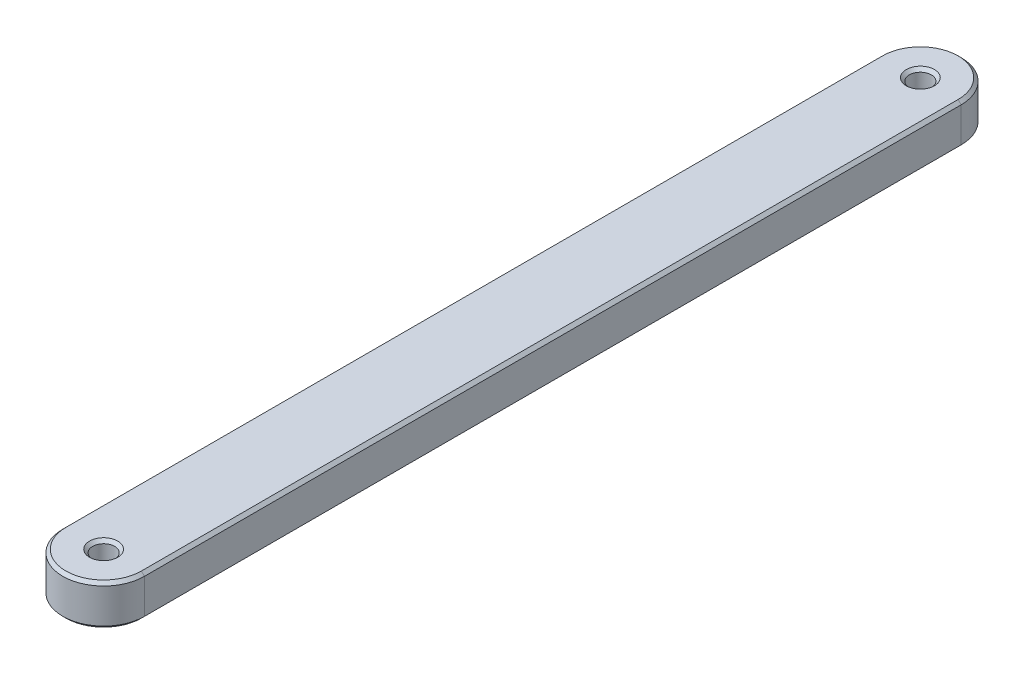
ISO-10303-21;
HEADER;
FILE_DESCRIPTION(('STEP AP214'),'2;1');
FILE_NAME('part.step','',(''),(''),'','','');
FILE_SCHEMA(('AUTOMOTIVE_DESIGN { 1 0 10303 214 1 1 1 1 }'));
ENDSEC;
DATA;
#1=APPLICATION_CONTEXT('core data for automotive mechanical design processes');
#2=APPLICATION_PROTOCOL_DEFINITION('international standard','automotive_design',2000,#1);
#3=PRODUCT_CONTEXT('',#1,'mechanical');
#4=PRODUCT('Part','Part','',(#3));
#5=PRODUCT_RELATED_PRODUCT_CATEGORY('part','',(#4));
#6=PRODUCT_DEFINITION_FORMATION('','',#4);
#7=PRODUCT_DEFINITION_CONTEXT('part definition',#1,'design');
#8=PRODUCT_DEFINITION('design','',#6,#7);
#9=PRODUCT_DEFINITION_SHAPE('','',#8);
#10=(LENGTH_UNIT() NAMED_UNIT(*) SI_UNIT(.MILLI.,.METRE.));
#11=(NAMED_UNIT(*) PLANE_ANGLE_UNIT() SI_UNIT($,.RADIAN.));
#12=(NAMED_UNIT(*) SI_UNIT($,.STERADIAN.) SOLID_ANGLE_UNIT());
#13=UNCERTAINTY_MEASURE_WITH_UNIT(LENGTH_MEASURE(1.E-05),#10,'distance_accuracy_value','');
#14=(GEOMETRIC_REPRESENTATION_CONTEXT(3) GLOBAL_UNCERTAINTY_ASSIGNED_CONTEXT((#13)) GLOBAL_UNIT_ASSIGNED_CONTEXT((#10,
#11,#12)) REPRESENTATION_CONTEXT('',''));
#15=CARTESIAN_POINT('',(0.,0.,0.));
#16=DIRECTION('',(0.,0.,1.));
#17=DIRECTION('',(1.,0.,0.));
#18=AXIS2_PLACEMENT_3D('',#15,#16,#17);
#19=CARTESIAN_POINT('',(0.,10.,100.));
#20=DIRECTION('',(0.,-1.,0.));
#21=DIRECTION('',(0.,0.,-1.));
#22=AXIS2_PLACEMENT_3D('',#19,#20,#21);
#23=CYLINDRICAL_SURFACE('',#22,2.7);
#24=CARTESIAN_POINT('',(0.,4.75000000000005,100.));
#25=DIRECTION('',(0.,-1.,0.));
#26=DIRECTION('',(0.,0.,-1.));
#27=AXIS2_PLACEMENT_3D('',#24,#25,#26);
#28=CIRCLE('',#27,2.7);
#29=CARTESIAN_POINT('',(0.,4.75000000000005,97.3000000000004));
#30=VERTEX_POINT('',#29);
#31=EDGE_CURVE('E197',#30,#30,#28,.T.);
#32=ORIENTED_EDGE('',*,*,#31,.T.);
#33=EDGE_LOOP('',(#32));
#34=FACE_BOUND('',#33,.T.);
#35=CARTESIAN_POINT('',(0.,9.25000000000003,100.));
#36=DIRECTION('',(0.,1.,0.));
#37=DIRECTION('',(0.,0.,1.));
#38=AXIS2_PLACEMENT_3D('',#35,#36,#37);
#39=CIRCLE('',#38,2.7);
#40=CARTESIAN_POINT('',(0.,9.25000000000003,102.7));
#41=VERTEX_POINT('',#40);
#42=EDGE_CURVE('E200',#41,#41,#39,.T.);
#43=ORIENTED_EDGE('',*,*,#42,.T.);
#44=EDGE_LOOP('',(#43));
#45=FACE_BOUND('',#44,.T.);
#46=ADVANCED_FACE('F39',(#34,#45),#23,.F.);
#47=CARTESIAN_POINT('',(0.,10.,-99.9999999999996));
#48=DIRECTION('',(0.,-1.,0.));
#49=DIRECTION('',(0.,0.,-1.));
#50=AXIS2_PLACEMENT_3D('',#47,#48,#49);
#51=CYLINDRICAL_SURFACE('',#50,2.7);
#52=CARTESIAN_POINT('',(0.,4.74999999999996,-99.9999999999996));
#53=DIRECTION('',(0.,-1.,0.));
#54=DIRECTION('',(0.,0.,-1.));
#55=AXIS2_PLACEMENT_3D('',#52,#53,#54);
#56=CIRCLE('',#55,2.7);
#57=CARTESIAN_POINT('',(0.,4.74999999999996,-102.7));
#58=VERTEX_POINT('',#57);
#59=EDGE_CURVE('E131',#58,#58,#56,.T.);
#60=ORIENTED_EDGE('',*,*,#59,.T.);
#61=EDGE_LOOP('',(#60));
#62=FACE_BOUND('',#61,.T.);
#63=CARTESIAN_POINT('',(0.,9.25000000000001,-99.9999999999996));
#64=DIRECTION('',(0.,1.,0.));
#65=DIRECTION('',(0.,0.,1.));
#66=AXIS2_PLACEMENT_3D('',#63,#64,#65);
#67=CIRCLE('',#66,2.7);
#68=CARTESIAN_POINT('',(0.,9.25000000000001,-97.2999999999996));
#69=VERTEX_POINT('',#68);
#70=EDGE_CURVE('E213',#69,#69,#67,.T.);
#71=ORIENTED_EDGE('',*,*,#70,.T.);
#72=EDGE_LOOP('',(#71));
#73=FACE_BOUND('',#72,.T.);
#74=ADVANCED_FACE('F253',(#62,#73),#51,.F.);
#75=CARTESIAN_POINT('',(10.,10.,0.));
#76=DIRECTION('',(-1.,0.,0.));
#77=DIRECTION('',(0.,0.,1.));
#78=AXIS2_PLACEMENT_3D('',#75,#76,#77);
#79=PLANE('',#78);
#80=DIRECTION('',(0.,-1.,0.));
#81=VECTOR('',#80,1.);
#82=CARTESIAN_POINT('',(10.,10.,-99.9999999999996));
#83=LINE('',#82,#81);
#84=CARTESIAN_POINT('',(10.,9.25,-99.9999999999996));
#85=VERTEX_POINT('',#84);
#86=CARTESIAN_POINT('',(10.,0.750000000000028,-99.9999999999996));
#87=VERTEX_POINT('',#86);
#88=EDGE_CURVE('E219',#85,#87,#83,.T.);
#89=ORIENTED_EDGE('',*,*,#88,.F.);
#90=DIRECTION('',(0.,0.,1.));
#91=VECTOR('',#90,1.);
#92=CARTESIAN_POINT('',(10.0000000000001,9.25,100.));
#93=LINE('',#92,#91);
#94=CARTESIAN_POINT('',(10.0000000000001,9.25,100.));
#95=VERTEX_POINT('',#94);
#96=EDGE_CURVE('E177',#85,#95,#93,.T.);
#97=ORIENTED_EDGE('',*,*,#96,.T.);
#98=DIRECTION('',(0.,-1.,0.));
#99=VECTOR('',#98,1.);
#100=CARTESIAN_POINT('',(10.0000000000001,10.,100.));
#101=LINE('',#100,#99);
#102=CARTESIAN_POINT('',(10.0000000000001,0.750000000000028,100.));
#103=VERTEX_POINT('',#102);
#104=EDGE_CURVE('E228',#95,#103,#101,.T.);
#105=ORIENTED_EDGE('',*,*,#104,.T.);
#106=DIRECTION('',(0.,0.,-1.));
#107=VECTOR('',#106,1.);
#108=CARTESIAN_POINT('',(10.,0.750000000000028,0.));
#109=LINE('',#108,#107);
#110=EDGE_CURVE('E179',#103,#87,#109,.T.);
#111=ORIENTED_EDGE('',*,*,#110,.T.);
#112=EDGE_LOOP('',(#89,#97,#105,#111));
#113=FACE_BOUND('',#112,.T.);
#114=ADVANCED_FACE('F259',(#113),#79,.F.);
#115=CARTESIAN_POINT('',(0.,10.,-99.9999999999996));
#116=DIRECTION('',(0.,-1.,0.));
#117=DIRECTION('',(0.,0.,-1.));
#118=AXIS2_PLACEMENT_3D('',#115,#116,#117);
#119=CYLINDRICAL_SURFACE('',#118,10.);
#120=DIRECTION('',(0.,-1.,0.));
#121=VECTOR('',#120,1.);
#122=CARTESIAN_POINT('',(-10.,10.,-99.9999999999996));
#123=LINE('',#122,#121);
#124=CARTESIAN_POINT('',(-10.,9.25,-99.9999999999996));
#125=VERTEX_POINT('',#124);
#126=CARTESIAN_POINT('',(-10.,0.750000000000028,-99.9999999999996));
#127=VERTEX_POINT('',#126);
#128=EDGE_CURVE('E222',#125,#127,#123,.T.);
#129=ORIENTED_EDGE('',*,*,#128,.F.);
#130=CARTESIAN_POINT('',(0.,9.25,-99.9999999999996));
#131=DIRECTION('',(0.,1.,0.));
#132=DIRECTION('',(0.,0.,1.));
#133=AXIS2_PLACEMENT_3D('',#130,#131,#132);
#134=CIRCLE('',#133,10.);
#135=EDGE_CURVE('E181',#125,#85,#134,.F.);
#136=ORIENTED_EDGE('',*,*,#135,.T.);
#137=ORIENTED_EDGE('',*,*,#88,.T.);
#138=CARTESIAN_POINT('',(0.,0.750000000000028,-99.9999999999996));
#139=DIRECTION('',(0.,1.,0.));
#140=DIRECTION('',(0.,0.,1.));
#141=AXIS2_PLACEMENT_3D('',#138,#139,#140);
#142=CIRCLE('',#141,10.);
#143=EDGE_CURVE('E183',#87,#127,#142,.T.);
#144=ORIENTED_EDGE('',*,*,#143,.T.);
#145=EDGE_LOOP('',(#129,#136,#137,#144));
#146=FACE_BOUND('',#145,.T.);
#147=ADVANCED_FACE('F378',(#146),#119,.T.);
#148=CARTESIAN_POINT('',(-10.,10.,0.));
#149=DIRECTION('',(-1.,0.,0.));
#150=DIRECTION('',(0.,0.,1.));
#151=AXIS2_PLACEMENT_3D('',#148,#149,#150);
#152=PLANE('',#151);
#153=DIRECTION('',(0.,-1.,0.));
#154=VECTOR('',#153,1.);
#155=CARTESIAN_POINT('',(-10.,10.,100.));
#156=LINE('',#155,#154);
#157=CARTESIAN_POINT('',(-10.,9.25,100.));
#158=VERTEX_POINT('',#157);
#159=CARTESIAN_POINT('',(-10.,0.750000000000028,100.));
#160=VERTEX_POINT('',#159);
#161=EDGE_CURVE('E225',#158,#160,#156,.T.);
#162=ORIENTED_EDGE('',*,*,#161,.F.);
#163=DIRECTION('',(0.,0.,-1.));
#164=VECTOR('',#163,1.);
#165=CARTESIAN_POINT('',(-10.,9.25,0.));
#166=LINE('',#165,#164);
#167=EDGE_CURVE('E188',#158,#125,#166,.T.);
#168=ORIENTED_EDGE('',*,*,#167,.T.);
#169=ORIENTED_EDGE('',*,*,#128,.T.);
#170=DIRECTION('',(0.,0.,1.));
#171=VECTOR('',#170,1.);
#172=CARTESIAN_POINT('',(-10.,0.750000000000028,100.));
#173=LINE('',#172,#171);
#174=EDGE_CURVE('E191',#127,#160,#173,.T.);
#175=ORIENTED_EDGE('',*,*,#174,.T.);
#176=EDGE_LOOP('',(#162,#168,#169,#175));
#177=FACE_BOUND('',#176,.T.);
#178=ADVANCED_FACE('F375',(#177),#152,.T.);
#179=CARTESIAN_POINT('',(0.,10.,100.));
#180=DIRECTION('',(0.,-1.,0.));
#181=DIRECTION('',(0.,0.,-1.));
#182=AXIS2_PLACEMENT_3D('',#179,#180,#181);
#183=CYLINDRICAL_SURFACE('',#182,10.);
#184=ORIENTED_EDGE('',*,*,#104,.F.);
#185=CARTESIAN_POINT('',(0.,9.25,100.));
#186=DIRECTION('',(0.,1.,0.));
#187=DIRECTION('',(0.,0.,1.));
#188=AXIS2_PLACEMENT_3D('',#185,#186,#187);
#189=CIRCLE('',#188,10.);
#190=EDGE_CURVE('E134',#95,#158,#189,.F.);
#191=ORIENTED_EDGE('',*,*,#190,.T.);
#192=ORIENTED_EDGE('',*,*,#161,.T.);
#193=CARTESIAN_POINT('',(0.,0.750000000000028,100.));
#194=DIRECTION('',(0.,1.,0.));
#195=DIRECTION('',(0.,0.,1.));
#196=AXIS2_PLACEMENT_3D('',#193,#194,#195);
#197=CIRCLE('',#196,10.);
#198=EDGE_CURVE('E186',#160,#103,#197,.T.);
#199=ORIENTED_EDGE('',*,*,#198,.T.);
#200=EDGE_LOOP('',(#184,#191,#192,#199));
#201=FACE_BOUND('',#200,.T.);
#202=ADVANCED_FACE('F370',(#201),#183,.T.);
#203=CARTESIAN_POINT('',(0.,10.,0.));
#204=DIRECTION('',(0.,1.,0.));
#205=DIRECTION('',(0.,0.,1.));
#206=AXIS2_PLACEMENT_3D('',#203,#204,#205);
#207=PLANE('',#206);
#208=CARTESIAN_POINT('',(0.,10.,-99.9999999999996));
#209=DIRECTION('',(0.,1.,0.));
#210=DIRECTION('',(0.,0.,1.));
#211=AXIS2_PLACEMENT_3D('',#208,#209,#210);
#212=CIRCLE('',#211,3.44999999999995);
#213=CARTESIAN_POINT('',(0.,10.,-96.5499999999997));
#214=VERTEX_POINT('',#213);
#215=EDGE_CURVE('E203',#214,#214,#212,.F.);
#216=ORIENTED_EDGE('',*,*,#215,.T.);
#217=EDGE_LOOP('',(#216));
#218=FACE_BOUND('',#217,.T.);
#219=CARTESIAN_POINT('',(0.,10.,100.));
#220=DIRECTION('',(0.,1.,0.));
#221=DIRECTION('',(0.,0.,1.));
#222=AXIS2_PLACEMENT_3D('',#219,#220,#221);
#223=CIRCLE('',#222,3.44999999999998);
#224=CARTESIAN_POINT('',(0.,10.,103.45));
#225=VERTEX_POINT('',#224);
#226=EDGE_CURVE('E206',#225,#225,#223,.F.);
#227=ORIENTED_EDGE('',*,*,#226,.T.);
#228=EDGE_LOOP('',(#227));
#229=FACE_BOUND('',#228,.T.);
#230=CARTESIAN_POINT('',(0.,10.,-99.9999999999996));
#231=DIRECTION('',(0.,1.,0.));
#232=DIRECTION('',(0.,0.,1.));
#233=AXIS2_PLACEMENT_3D('',#230,#231,#232);
#234=CIRCLE('',#233,9.25);
#235=CARTESIAN_POINT('',(9.25,10.,-99.9999999999996));
#236=VERTEX_POINT('',#235);
#237=CARTESIAN_POINT('',(-9.25,10.,-99.9999999999996));
#238=VERTEX_POINT('',#237);
#239=EDGE_CURVE('E120',#236,#238,#234,.T.);
#240=ORIENTED_EDGE('',*,*,#239,.T.);
#241=DIRECTION('',(0.,0.,1.));
#242=VECTOR('',#241,1.);
#243=CARTESIAN_POINT('',(-9.25,10.,0.));
#244=LINE('',#243,#242);
#245=CARTESIAN_POINT('',(-9.25000000000004,10.,100.));
#246=VERTEX_POINT('',#245);
#247=EDGE_CURVE('E116',#238,#246,#244,.T.);
#248=ORIENTED_EDGE('',*,*,#247,.T.);
#249=CARTESIAN_POINT('',(0.,10.,100.));
#250=DIRECTION('',(0.,1.,0.));
#251=DIRECTION('',(0.,0.,1.));
#252=AXIS2_PLACEMENT_3D('',#249,#250,#251);
#253=CIRCLE('',#252,9.25000000000004);
#254=CARTESIAN_POINT('',(9.25000000000007,10.,100.));
#255=VERTEX_POINT('',#254);
#256=EDGE_CURVE('E110',#246,#255,#253,.T.);
#257=ORIENTED_EDGE('',*,*,#256,.T.);
#258=DIRECTION('',(0.,0.,-1.));
#259=VECTOR('',#258,1.);
#260=CARTESIAN_POINT('',(9.25,10.,-99.9999999999996));
#261=LINE('',#260,#259);
#262=EDGE_CURVE('E113',#255,#236,#261,.T.);
#263=ORIENTED_EDGE('',*,*,#262,.T.);
#264=EDGE_LOOP('',(#240,#248,#257,#263));
#265=FACE_BOUND('',#264,.T.);
#266=ADVANCED_FACE('F112',(#218,#229,#265),#207,.T.);
#267=CARTESIAN_POINT('',(0.,0.,0.));
#268=DIRECTION('',(0.,1.,0.));
#269=DIRECTION('',(0.,0.,1.));
#270=AXIS2_PLACEMENT_3D('',#267,#268,#269);
#271=PLANE('',#270);
#272=CARTESIAN_POINT('',(0.,0.,100.));
#273=DIRECTION('',(0.,1.,0.));
#274=DIRECTION('',(0.,0.,1.));
#275=AXIS2_PLACEMENT_3D('',#272,#273,#274);
#276=CIRCLE('',#275,9.25000000000001);
#277=CARTESIAN_POINT('',(9.25000000000005,0.,100.));
#278=VERTEX_POINT('',#277);
#279=CARTESIAN_POINT('',(-9.25000000000001,0.,100.));
#280=VERTEX_POINT('',#279);
#281=EDGE_CURVE('E57',#278,#280,#276,.F.);
#282=ORIENTED_EDGE('',*,*,#281,.T.);
#283=DIRECTION('',(0.,0.,-1.));
#284=VECTOR('',#283,1.);
#285=CARTESIAN_POINT('',(-9.24999999999997,0.,-99.9999999999996));
#286=LINE('',#285,#284);
#287=CARTESIAN_POINT('',(-9.24999999999997,0.,-99.9999999999996));
#288=VERTEX_POINT('',#287);
#289=EDGE_CURVE('E164',#280,#288,#286,.T.);
#290=ORIENTED_EDGE('',*,*,#289,.T.);
#291=CARTESIAN_POINT('',(0.,0.,-99.9999999999996));
#292=DIRECTION('',(0.,1.,0.));
#293=DIRECTION('',(0.,0.,1.));
#294=AXIS2_PLACEMENT_3D('',#291,#292,#293);
#295=CIRCLE('',#294,9.24999999999997);
#296=CARTESIAN_POINT('',(9.24999999999997,0.,-99.9999999999996));
#297=VERTEX_POINT('',#296);
#298=EDGE_CURVE('E167',#288,#297,#295,.F.);
#299=ORIENTED_EDGE('',*,*,#298,.T.);
#300=DIRECTION('',(0.,0.,1.));
#301=VECTOR('',#300,1.);
#302=CARTESIAN_POINT('',(9.25000000000001,0.,0.));
#303=LINE('',#302,#301);
#304=EDGE_CURVE('E169',#297,#278,#303,.T.);
#305=ORIENTED_EDGE('',*,*,#304,.T.);
#306=EDGE_LOOP('',(#282,#290,#299,#305));
#307=FACE_BOUND('',#306,.T.);
#308=CARTESIAN_POINT('',(0.,0.,100.));
#309=DIRECTION('',(0.,1.,0.));
#310=DIRECTION('',(0.,0.,1.));
#311=AXIS2_PLACEMENT_3D('',#308,#309,#310);
#312=CIRCLE('',#311,7.25000000000009);
#313=CARTESIAN_POINT('',(0.,0.,107.25));
#314=VERTEX_POINT('',#313);
#315=EDGE_CURVE('E171',#314,#314,#312,.T.);
#316=ORIENTED_EDGE('',*,*,#315,.T.);
#317=EDGE_LOOP('',(#316));
#318=FACE_BOUND('',#317,.T.);
#319=CARTESIAN_POINT('',(0.,0.,-99.9999999999996));
#320=DIRECTION('',(0.,1.,0.));
#321=DIRECTION('',(0.,0.,1.));
#322=AXIS2_PLACEMENT_3D('',#319,#320,#321);
#323=CIRCLE('',#322,7.25000000000003);
#324=CARTESIAN_POINT('',(0.,0.,-92.7499999999996));
#325=VERTEX_POINT('',#324);
#326=EDGE_CURVE('E174',#325,#325,#323,.T.);
#327=ORIENTED_EDGE('',*,*,#326,.T.);
#328=EDGE_LOOP('',(#327));
#329=FACE_BOUND('',#328,.T.);
#330=ADVANCED_FACE('F354',(#307,#318,#329),#271,.F.);
#331=CARTESIAN_POINT('',(0.,4.,-99.9999999999996));
#332=DIRECTION('',(0.,-1.,0.));
#333=DIRECTION('',(0.,0.,-1.));
#334=AXIS2_PLACEMENT_3D('',#331,#332,#333);
#335=PLANE('',#334);
#336=CARTESIAN_POINT('',(0.,4.,-99.9999999999996));
#337=DIRECTION('',(0.,-1.,0.));
#338=DIRECTION('',(0.,0.,-1.));
#339=AXIS2_PLACEMENT_3D('',#336,#337,#338);
#340=CIRCLE('',#339,3.44999999999995);
#341=CARTESIAN_POINT('',(0.,4.,-103.45));
#342=VERTEX_POINT('',#341);
#343=EDGE_CURVE('E216',#342,#342,#340,.F.);
#344=ORIENTED_EDGE('',*,*,#343,.T.);
#345=EDGE_LOOP('',(#344));
#346=FACE_BOUND('',#345,.T.);
#347=CARTESIAN_POINT('',(0.,4.,-99.9999999999996));
#348=DIRECTION('',(0.,-1.,0.));
#349=DIRECTION('',(0.,0.,-1.));
#350=AXIS2_PLACEMENT_3D('',#347,#348,#349);
#351=CIRCLE('',#350,6.5);
#352=CARTESIAN_POINT('',(0.,4.,-106.5));
#353=VERTEX_POINT('',#352);
#354=EDGE_CURVE('E135',#353,#353,#351,.T.);
#355=ORIENTED_EDGE('',*,*,#354,.T.);
#356=EDGE_LOOP('',(#355));
#357=FACE_BOUND('',#356,.T.);
#358=ADVANCED_FACE('F248',(#346,#357),#335,.T.);
#359=CARTESIAN_POINT('',(0.,4.,-99.9999999999996));
#360=DIRECTION('',(0.,-1.,0.));
#361=DIRECTION('',(0.,0.,-1.));
#362=AXIS2_PLACEMENT_3D('',#359,#360,#361);
#363=CYLINDRICAL_SURFACE('',#362,6.5);
#364=CARTESIAN_POINT('',(0.,0.750000000000028,-99.9999999999996));
#365=DIRECTION('',(0.,1.,0.));
#366=DIRECTION('',(0.,0.,1.));
#367=AXIS2_PLACEMENT_3D('',#364,#365,#366);
#368=CIRCLE('',#367,6.5);
#369=CARTESIAN_POINT('',(0.,0.750000000000028,-93.4999999999996));
#370=VERTEX_POINT('',#369);
#371=EDGE_CURVE('E11',#370,#370,#368,.F.);
#372=ORIENTED_EDGE('',*,*,#371,.T.);
#373=EDGE_LOOP('',(#372));
#374=FACE_BOUND('',#373,.T.);
#375=ORIENTED_EDGE('',*,*,#354,.F.);
#376=EDGE_LOOP('',(#375));
#377=FACE_BOUND('',#376,.T.);
#378=ADVANCED_FACE('F238',(#374,#377),#363,.F.);
#379=CARTESIAN_POINT('',(0.,4.,100.));
#380=DIRECTION('',(0.,-1.,0.));
#381=DIRECTION('',(0.,0.,-1.));
#382=AXIS2_PLACEMENT_3D('',#379,#380,#381);
#383=CYLINDRICAL_SURFACE('',#382,6.5);
#384=CARTESIAN_POINT('',(0.,0.750000000000055,100.));
#385=DIRECTION('',(0.,1.,0.));
#386=DIRECTION('',(0.,0.,1.));
#387=AXIS2_PLACEMENT_3D('',#384,#385,#386);
#388=CIRCLE('',#387,6.5);
#389=CARTESIAN_POINT('',(0.,0.750000000000055,106.5));
#390=VERTEX_POINT('',#389);
#391=EDGE_CURVE('E49',#390,#390,#388,.F.);
#392=ORIENTED_EDGE('',*,*,#391,.T.);
#393=EDGE_LOOP('',(#392));
#394=FACE_BOUND('',#393,.T.);
#395=CARTESIAN_POINT('',(0.,4.,100.));
#396=DIRECTION('',(0.,-1.,0.));
#397=DIRECTION('',(0.,0.,-1.));
#398=AXIS2_PLACEMENT_3D('',#395,#396,#397);
#399=CIRCLE('',#398,6.5);
#400=CARTESIAN_POINT('',(0.,4.,93.5000000000004));
#401=VERTEX_POINT('',#400);
#402=EDGE_CURVE('E138',#401,#401,#399,.T.);
#403=ORIENTED_EDGE('',*,*,#402,.F.);
#404=EDGE_LOOP('',(#403));
#405=FACE_BOUND('',#404,.T.);
#406=ADVANCED_FACE('F236',(#394,#405),#383,.F.);
#407=CARTESIAN_POINT('',(0.,4.,100.));
#408=DIRECTION('',(0.,-1.,0.));
#409=DIRECTION('',(0.,0.,-1.));
#410=AXIS2_PLACEMENT_3D('',#407,#408,#409);
#411=PLANE('',#410);
#412=CARTESIAN_POINT('',(0.,4.,100.));
#413=DIRECTION('',(0.,-1.,0.));
#414=DIRECTION('',(0.,0.,-1.));
#415=AXIS2_PLACEMENT_3D('',#412,#413,#414);
#416=CIRCLE('',#415,3.45000000000006);
#417=CARTESIAN_POINT('',(0.,4.,96.5500000000003));
#418=VERTEX_POINT('',#417);
#419=EDGE_CURVE('E194',#418,#418,#416,.F.);
#420=ORIENTED_EDGE('',*,*,#419,.T.);
#421=EDGE_LOOP('',(#420));
#422=FACE_BOUND('',#421,.T.);
#423=ORIENTED_EDGE('',*,*,#402,.T.);
#424=EDGE_LOOP('',(#423));
#425=FACE_BOUND('',#424,.T.);
#426=ADVANCED_FACE('F234',(#422,#425),#411,.T.);
#427=CARTESIAN_POINT('',(0.,4.,-99.9999999999996));
#428=DIRECTION('',(0.,-1.,0.));
#429=DIRECTION('',(0.,0.,-1.));
#430=AXIS2_PLACEMENT_3D('',#427,#428,#429);
#431=CONICAL_SURFACE('',#430,3.44999999999995,0.785398163397442);
#432=ORIENTED_EDGE('',*,*,#59,.F.);
#433=EDGE_LOOP('',(#432));
#434=FACE_BOUND('',#433,.T.);
#435=ORIENTED_EDGE('',*,*,#343,.F.);
#436=EDGE_LOOP('',(#435));
#437=FACE_BOUND('',#436,.T.);
#438=ADVANCED_FACE('F245',(#434,#437),#431,.F.);
#439=CARTESIAN_POINT('',(0.,10.,-99.9999999999996));
#440=DIRECTION('',(0.,1.,0.));
#441=DIRECTION('',(0.,0.,1.));
#442=AXIS2_PLACEMENT_3D('',#439,#440,#441);
#443=CONICAL_SURFACE('',#442,3.44999999999995,0.785398163397423);
#444=ORIENTED_EDGE('',*,*,#70,.F.);
#445=EDGE_LOOP('',(#444));
#446=FACE_BOUND('',#445,.T.);
#447=ORIENTED_EDGE('',*,*,#215,.F.);
#448=EDGE_LOOP('',(#447));
#449=FACE_BOUND('',#448,.T.);
#450=ADVANCED_FACE('F272',(#446,#449),#443,.F.);
#451=CARTESIAN_POINT('',(0.,4.75000000000005,100.));
#452=DIRECTION('',(0.,-1.,0.));
#453=DIRECTION('',(0.,0.,-1.));
#454=AXIS2_PLACEMENT_3D('',#451,#452,#453);
#455=CONICAL_SURFACE('',#454,2.7,0.78539816339746);
#456=ORIENTED_EDGE('',*,*,#419,.F.);
#457=EDGE_LOOP('',(#456));
#458=FACE_BOUND('',#457,.T.);
#459=ORIENTED_EDGE('',*,*,#31,.F.);
#460=EDGE_LOOP('',(#459));
#461=FACE_BOUND('',#460,.T.);
#462=ADVANCED_FACE('F279',(#458,#461),#455,.F.);
#463=CARTESIAN_POINT('',(0.,9.25000000000003,100.));
#464=DIRECTION('',(0.,1.,0.));
#465=DIRECTION('',(0.,0.,1.));
#466=AXIS2_PLACEMENT_3D('',#463,#464,#465);
#467=CONICAL_SURFACE('',#466,2.7,0.785398163397457);
#468=ORIENTED_EDGE('',*,*,#226,.F.);
#469=EDGE_LOOP('',(#468));
#470=FACE_BOUND('',#469,.T.);
#471=ORIENTED_EDGE('',*,*,#42,.F.);
#472=EDGE_LOOP('',(#471));
#473=FACE_BOUND('',#472,.T.);
#474=ADVANCED_FACE('F286',(#470,#473),#467,.F.);
#475=CARTESIAN_POINT('',(9.25000000000004,10.,0.));
#476=DIRECTION('',(0.707106781186547,0.707106781186547,0.));
#477=DIRECTION('',(0.,0.,1.));
#478=AXIS2_PLACEMENT_3D('',#475,#476,#477);
#479=PLANE('',#478);
#480=DIRECTION('',(0.707106781186547,-0.707106781186547,0.));
#481=VECTOR('',#480,1.);
#482=CARTESIAN_POINT('',(9.25,10.,-99.9999999999996));
#483=LINE('',#482,#481);
#484=EDGE_CURVE('E129',#236,#85,#483,.T.);
#485=ORIENTED_EDGE('',*,*,#484,.F.);
#486=ORIENTED_EDGE('',*,*,#262,.F.);
#487=DIRECTION('',(-0.707106781186547,0.707106781186547,0.));
#488=VECTOR('',#487,1.);
#489=CARTESIAN_POINT('',(10.0000000000001,9.25,100.));
#490=LINE('',#489,#488);
#491=EDGE_CURVE('E126',#95,#255,#490,.T.);
#492=ORIENTED_EDGE('',*,*,#491,.F.);
#493=ORIENTED_EDGE('',*,*,#96,.F.);
#494=EDGE_LOOP('',(#485,#486,#492,#493));
#495=FACE_BOUND('',#494,.T.);
#496=ADVANCED_FACE('F124',(#495),#479,.T.);
#497=CARTESIAN_POINT('',(0.,9.25,100.));
#498=DIRECTION('',(0.,-1.,0.));
#499=DIRECTION('',(0.,0.,-1.));
#500=AXIS2_PLACEMENT_3D('',#497,#498,#499);
#501=CONICAL_SURFACE('',#500,10.,0.785398163397448);
#502=ORIENTED_EDGE('',*,*,#491,.T.);
#503=ORIENTED_EDGE('',*,*,#256,.F.);
#504=DIRECTION('',(0.707106781186547,0.707106781186547,0.));
#505=VECTOR('',#504,1.);
#506=CARTESIAN_POINT('',(-10.,9.25,100.));
#507=LINE('',#506,#505);
#508=EDGE_CURVE('E140',#158,#246,#507,.T.);
#509=ORIENTED_EDGE('',*,*,#508,.F.);
#510=ORIENTED_EDGE('',*,*,#190,.F.);
#511=EDGE_LOOP('',(#502,#503,#509,#510));
#512=FACE_BOUND('',#511,.T.);
#513=ADVANCED_FACE('F133',(#512),#501,.T.);
#514=CARTESIAN_POINT('',(0.,10.,-99.9999999999996));
#515=DIRECTION('',(0.,-1.,0.));
#516=DIRECTION('',(0.,0.,-1.));
#517=AXIS2_PLACEMENT_3D('',#514,#515,#516);
#518=CONICAL_SURFACE('',#517,9.25,0.785398163397448);
#519=ORIENTED_EDGE('',*,*,#484,.T.);
#520=ORIENTED_EDGE('',*,*,#135,.F.);
#521=DIRECTION('',(-0.707106781186547,-0.707106781186547,0.));
#522=VECTOR('',#521,1.);
#523=CARTESIAN_POINT('',(-9.25,10.,-99.9999999999996));
#524=LINE('',#523,#522);
#525=EDGE_CURVE('E152',#238,#125,#524,.T.);
#526=ORIENTED_EDGE('',*,*,#525,.F.);
#527=ORIENTED_EDGE('',*,*,#239,.F.);
#528=EDGE_LOOP('',(#519,#520,#526,#527));
#529=FACE_BOUND('',#528,.T.);
#530=ADVANCED_FACE('F303',(#529),#518,.T.);
#531=CARTESIAN_POINT('',(-10.,9.25,0.));
#532=DIRECTION('',(0.707106781186547,-0.707106781186547,0.));
#533=DIRECTION('',(0.,0.,-1.));
#534=AXIS2_PLACEMENT_3D('',#531,#532,#533);
#535=PLANE('',#534);
#536=ORIENTED_EDGE('',*,*,#508,.T.);
#537=ORIENTED_EDGE('',*,*,#247,.F.);
#538=ORIENTED_EDGE('',*,*,#525,.T.);
#539=ORIENTED_EDGE('',*,*,#167,.F.);
#540=EDGE_LOOP('',(#536,#537,#538,#539));
#541=FACE_BOUND('',#540,.T.);
#542=ADVANCED_FACE('F295',(#541),#535,.F.);
#543=CARTESIAN_POINT('',(10.,0.750000000000028,0.));
#544=DIRECTION('',(-0.707106781186547,0.707106781186547,0.));
#545=DIRECTION('',(0.,0.,-1.));
#546=AXIS2_PLACEMENT_3D('',#543,#544,#545);
#547=PLANE('',#546);
#548=DIRECTION('',(-0.707106781186547,-0.707106781186547,0.));
#549=VECTOR('',#548,1.);
#550=CARTESIAN_POINT('',(10.,0.750000000000028,-99.9999999999996));
#551=LINE('',#550,#549);
#552=EDGE_CURVE('E146',#87,#297,#551,.T.);
#553=ORIENTED_EDGE('',*,*,#552,.F.);
#554=ORIENTED_EDGE('',*,*,#110,.F.);
#555=DIRECTION('',(0.707106781186547,0.707106781186547,0.));
#556=VECTOR('',#555,1.);
#557=CARTESIAN_POINT('',(9.25000000000005,0.,100.));
#558=LINE('',#557,#556);
#559=EDGE_CURVE('E44',#278,#103,#558,.T.);
#560=ORIENTED_EDGE('',*,*,#559,.F.);
#561=ORIENTED_EDGE('',*,*,#304,.F.);
#562=EDGE_LOOP('',(#553,#554,#560,#561));
#563=FACE_BOUND('',#562,.T.);
#564=ADVANCED_FACE('F302',(#563),#547,.F.);
#565=CARTESIAN_POINT('',(0.,0.,100.));
#566=DIRECTION('',(0.,1.,0.));
#567=DIRECTION('',(0.,0.,1.));
#568=AXIS2_PLACEMENT_3D('',#565,#566,#567);
#569=CONICAL_SURFACE('',#568,9.25000000000001,0.785398163397448);
#570=ORIENTED_EDGE('',*,*,#559,.T.);
#571=ORIENTED_EDGE('',*,*,#198,.F.);
#572=DIRECTION('',(-0.707106781186547,0.707106781186547,0.));
#573=VECTOR('',#572,1.);
#574=CARTESIAN_POINT('',(-9.25000000000001,0.,100.));
#575=LINE('',#574,#573);
#576=EDGE_CURVE('E145',#280,#160,#575,.T.);
#577=ORIENTED_EDGE('',*,*,#576,.F.);
#578=ORIENTED_EDGE('',*,*,#281,.F.);
#579=EDGE_LOOP('',(#570,#571,#577,#578));
#580=FACE_BOUND('',#579,.T.);
#581=ADVANCED_FACE('F333',(#580),#569,.T.);
#582=CARTESIAN_POINT('',(0.,0.750000000000028,-99.9999999999996));
#583=DIRECTION('',(0.,1.,0.));
#584=DIRECTION('',(0.,0.,1.));
#585=AXIS2_PLACEMENT_3D('',#582,#583,#584);
#586=CONICAL_SURFACE('',#585,10.,0.785398163397448);
#587=ORIENTED_EDGE('',*,*,#552,.T.);
#588=ORIENTED_EDGE('',*,*,#298,.F.);
#589=DIRECTION('',(0.707106781186547,-0.707106781186547,0.));
#590=VECTOR('',#589,1.);
#591=CARTESIAN_POINT('',(-10.,0.750000000000028,-99.9999999999996));
#592=LINE('',#591,#590);
#593=EDGE_CURVE('E65',#127,#288,#592,.T.);
#594=ORIENTED_EDGE('',*,*,#593,.F.);
#595=ORIENTED_EDGE('',*,*,#143,.F.);
#596=EDGE_LOOP('',(#587,#588,#594,#595));
#597=FACE_BOUND('',#596,.T.);
#598=ADVANCED_FACE('F327',(#597),#586,.T.);
#599=CARTESIAN_POINT('',(-9.24999999999997,0.,0.));
#600=DIRECTION('',(-0.707106781186547,-0.707106781186547,0.));
#601=DIRECTION('',(0.,0.,1.));
#602=AXIS2_PLACEMENT_3D('',#599,#600,#601);
#603=PLANE('',#602);
#604=ORIENTED_EDGE('',*,*,#576,.T.);
#605=ORIENTED_EDGE('',*,*,#174,.F.);
#606=ORIENTED_EDGE('',*,*,#593,.T.);
#607=ORIENTED_EDGE('',*,*,#289,.F.);
#608=EDGE_LOOP('',(#604,#605,#606,#607));
#609=FACE_BOUND('',#608,.T.);
#610=ADVANCED_FACE('F319',(#609),#603,.T.);
#611=CARTESIAN_POINT('',(0.,0.750000000000055,100.));
#612=DIRECTION('',(0.,-1.,0.));
#613=DIRECTION('',(0.,0.,-1.));
#614=AXIS2_PLACEMENT_3D('',#611,#612,#613);
#615=CONICAL_SURFACE('',#614,6.5,0.78539816339747);
#616=ORIENTED_EDGE('',*,*,#315,.F.);
#617=EDGE_LOOP('',(#616));
#618=FACE_BOUND('',#617,.T.);
#619=ORIENTED_EDGE('',*,*,#391,.F.);
#620=EDGE_LOOP('',(#619));
#621=FACE_BOUND('',#620,.T.);
#622=ADVANCED_FACE('F326',(#618,#621),#615,.F.);
#623=CARTESIAN_POINT('',(0.,0.750000000000028,-99.9999999999996));
#624=DIRECTION('',(0.,-1.,0.));
#625=DIRECTION('',(0.,0.,-1.));
#626=AXIS2_PLACEMENT_3D('',#623,#624,#625);
#627=CONICAL_SURFACE('',#626,6.5,0.785398163397452);
#628=ORIENTED_EDGE('',*,*,#326,.F.);
#629=EDGE_LOOP('',(#628));
#630=FACE_BOUND('',#629,.T.);
#631=ORIENTED_EDGE('',*,*,#371,.F.);
#632=EDGE_LOOP('',(#631));
#633=FACE_BOUND('',#632,.T.);
#634=ADVANCED_FACE('F42',(#630,#633),#627,.F.);
#635=CLOSED_SHELL('',(#46,#74,#114,#147,#178,#202,#266,#330,#358,#378,#406,#426,#438,#450,#462,
#474,#496,#513,#530,#542,#564,#581,#598,#610,#622,#634));
#636=MANIFOLD_SOLID_BREP('B2',#635);
#637=ADVANCED_BREP_SHAPE_REPRESENTATION('',(#18,#636),#14);
#638=SHAPE_DEFINITION_REPRESENTATION(#9,#637);
ENDSEC;
END-ISO-10303-21;
